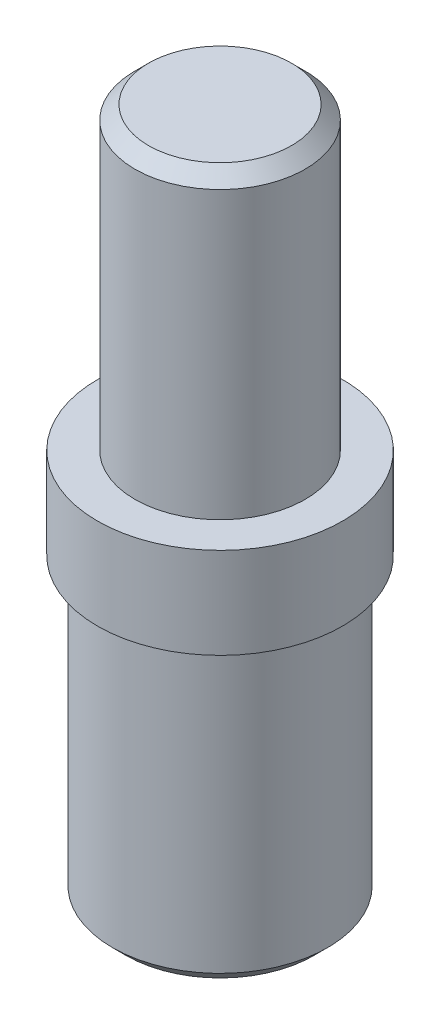
ISO-10303-21;
HEADER;
FILE_DESCRIPTION(('STEP AP214'),'2;1');
FILE_NAME('part.step','',(''),(''),'','','');
FILE_SCHEMA(('AUTOMOTIVE_DESIGN { 1 0 10303 214 1 1 1 1 }'));
ENDSEC;
DATA;
#1=APPLICATION_CONTEXT('core data for automotive mechanical design processes');
#2=APPLICATION_PROTOCOL_DEFINITION('international standard','automotive_design',2000,#1);
#3=PRODUCT_CONTEXT('',#1,'mechanical');
#4=PRODUCT('Part','Part','',(#3));
#5=PRODUCT_RELATED_PRODUCT_CATEGORY('part','',(#4));
#6=PRODUCT_DEFINITION_FORMATION('','',#4);
#7=PRODUCT_DEFINITION_CONTEXT('part definition',#1,'design');
#8=PRODUCT_DEFINITION('design','',#6,#7);
#9=PRODUCT_DEFINITION_SHAPE('','',#8);
#10=(LENGTH_UNIT() NAMED_UNIT(*) SI_UNIT(.MILLI.,.METRE.));
#11=(NAMED_UNIT(*) PLANE_ANGLE_UNIT() SI_UNIT($,.RADIAN.));
#12=(NAMED_UNIT(*) SI_UNIT($,.STERADIAN.) SOLID_ANGLE_UNIT());
#13=UNCERTAINTY_MEASURE_WITH_UNIT(LENGTH_MEASURE(1.E-05),#10,'distance_accuracy_value','');
#14=(GEOMETRIC_REPRESENTATION_CONTEXT(3) GLOBAL_UNCERTAINTY_ASSIGNED_CONTEXT((#13)) GLOBAL_UNIT_ASSIGNED_CONTEXT((#10,
#11,#12)) REPRESENTATION_CONTEXT('',''));
#15=CARTESIAN_POINT('',(0.,0.,0.));
#16=DIRECTION('',(0.,0.,1.));
#17=DIRECTION('',(1.,0.,0.));
#18=AXIS2_PLACEMENT_3D('',#15,#16,#17);
#19=CARTESIAN_POINT('',(0.,11.,0.));
#20=DIRECTION('',(0.,-1.,0.));
#21=DIRECTION('',(0.,0.,-1.));
#22=AXIS2_PLACEMENT_3D('',#19,#20,#21);
#23=CYLINDRICAL_SURFACE('',#22,3.95);
#24=CARTESIAN_POINT('',(0.,0.500000000000002,0.));
#25=DIRECTION('',(0.,1.,0.));
#26=DIRECTION('',(0.,0.,1.));
#27=AXIS2_PLACEMENT_3D('',#24,#25,#26);
#28=CIRCLE('',#27,3.95);
#29=CARTESIAN_POINT('',(0.,0.500000000000002,3.95));
#30=VERTEX_POINT('',#29);
#31=EDGE_CURVE('E47',#30,#30,#28,.T.);
#32=ORIENTED_EDGE('',*,*,#31,.T.);
#33=EDGE_LOOP('',(#32));
#34=FACE_BOUND('',#33,.T.);
#35=CARTESIAN_POINT('',(0.,11.,0.));
#36=DIRECTION('',(0.,1.,0.));
#37=DIRECTION('',(0.,0.,1.));
#38=AXIS2_PLACEMENT_3D('',#35,#36,#37);
#39=CIRCLE('',#38,3.95);
#40=CARTESIAN_POINT('',(0.,11.,3.95));
#41=VERTEX_POINT('',#40);
#42=EDGE_CURVE('E53',#41,#41,#39,.T.);
#43=ORIENTED_EDGE('',*,*,#42,.F.);
#44=EDGE_LOOP('',(#43));
#45=FACE_BOUND('',#44,.T.);
#46=ADVANCED_FACE('F32',(#34,#45),#23,.T.);
#47=CARTESIAN_POINT('',(0.,0.,0.));
#48=DIRECTION('',(0.,1.,0.));
#49=DIRECTION('',(0.,0.,1.));
#50=AXIS2_PLACEMENT_3D('',#47,#48,#49);
#51=PLANE('',#50);
#52=CARTESIAN_POINT('',(0.,0.,0.));
#53=DIRECTION('',(0.,1.,0.));
#54=DIRECTION('',(0.,0.,1.));
#55=AXIS2_PLACEMENT_3D('',#52,#53,#54);
#56=CIRCLE('',#55,3.45);
#57=CARTESIAN_POINT('',(0.,0.,3.45));
#58=VERTEX_POINT('',#57);
#59=EDGE_CURVE('E43',#58,#58,#56,.F.);
#60=ORIENTED_EDGE('',*,*,#59,.T.);
#61=EDGE_LOOP('',(#60));
#62=FACE_BOUND('',#61,.T.);
#63=ADVANCED_FACE('F77',(#62),#51,.F.);
#64=CARTESIAN_POINT('',(0.,14.34,0.));
#65=DIRECTION('',(0.,-1.,0.));
#66=DIRECTION('',(0.,0.,-1.));
#67=AXIS2_PLACEMENT_3D('',#64,#65,#66);
#68=CYLINDRICAL_SURFACE('',#67,4.5);
#69=CARTESIAN_POINT('',(0.,14.34,0.));
#70=DIRECTION('',(0.,1.,0.));
#71=DIRECTION('',(0.,0.,1.));
#72=AXIS2_PLACEMENT_3D('',#69,#70,#71);
#73=CIRCLE('',#72,4.5);
#74=CARTESIAN_POINT('',(0.,14.34,4.5));
#75=VERTEX_POINT('',#74);
#76=EDGE_CURVE('E56',#75,#75,#73,.T.);
#77=ORIENTED_EDGE('',*,*,#76,.F.);
#78=EDGE_LOOP('',(#77));
#79=FACE_BOUND('',#78,.T.);
#80=CARTESIAN_POINT('',(0.,11.,0.));
#81=DIRECTION('',(0.,1.,0.));
#82=DIRECTION('',(0.,0.,1.));
#83=AXIS2_PLACEMENT_3D('',#80,#81,#82);
#84=CIRCLE('',#83,4.5);
#85=CARTESIAN_POINT('',(0.,11.,4.5));
#86=VERTEX_POINT('',#85);
#87=EDGE_CURVE('E57',#86,#86,#84,.T.);
#88=ORIENTED_EDGE('',*,*,#87,.T.);
#89=EDGE_LOOP('',(#88));
#90=FACE_BOUND('',#89,.T.);
#91=ADVANCED_FACE('F71',(#79,#90),#68,.T.);
#92=CARTESIAN_POINT('',(0.,14.34,0.));
#93=DIRECTION('',(0.,1.,0.));
#94=DIRECTION('',(0.,0.,1.));
#95=AXIS2_PLACEMENT_3D('',#92,#93,#94);
#96=PLANE('',#95);
#97=CARTESIAN_POINT('',(0.,14.34,0.));
#98=DIRECTION('',(0.,1.,0.));
#99=DIRECTION('',(0.,0.,1.));
#100=AXIS2_PLACEMENT_3D('',#97,#98,#99);
#101=CIRCLE('',#100,3.125);
#102=CARTESIAN_POINT('',(0.,14.34,3.125));
#103=VERTEX_POINT('',#102);
#104=EDGE_CURVE('E52',#103,#103,#101,.T.);
#105=ORIENTED_EDGE('',*,*,#104,.F.);
#106=EDGE_LOOP('',(#105));
#107=FACE_BOUND('',#106,.T.);
#108=ORIENTED_EDGE('',*,*,#76,.T.);
#109=EDGE_LOOP('',(#108));
#110=FACE_BOUND('',#109,.T.);
#111=ADVANCED_FACE('F67',(#107,#110),#96,.T.);
#112=CARTESIAN_POINT('',(0.,11.,0.));
#113=DIRECTION('',(0.,1.,0.));
#114=DIRECTION('',(0.,0.,1.));
#115=AXIS2_PLACEMENT_3D('',#112,#113,#114);
#116=PLANE('',#115);
#117=ORIENTED_EDGE('',*,*,#42,.T.);
#118=EDGE_LOOP('',(#117));
#119=FACE_BOUND('',#118,.T.);
#120=ORIENTED_EDGE('',*,*,#87,.F.);
#121=EDGE_LOOP('',(#120));
#122=FACE_BOUND('',#121,.T.);
#123=ADVANCED_FACE('F70',(#119,#122),#116,.F.);
#124=CARTESIAN_POINT('',(0.,25.34,0.));
#125=DIRECTION('',(0.,-1.,0.));
#126=DIRECTION('',(0.,0.,-1.));
#127=AXIS2_PLACEMENT_3D('',#124,#125,#126);
#128=CYLINDRICAL_SURFACE('',#127,3.125);
#129=CARTESIAN_POINT('',(0.,24.84,0.));
#130=DIRECTION('',(0.,1.,0.));
#131=DIRECTION('',(0.,0.,1.));
#132=AXIS2_PLACEMENT_3D('',#129,#130,#131);
#133=CIRCLE('',#132,3.125);
#134=CARTESIAN_POINT('',(0.,24.84,3.125));
#135=VERTEX_POINT('',#134);
#136=EDGE_CURVE('E10',#135,#135,#133,.F.);
#137=ORIENTED_EDGE('',*,*,#136,.T.);
#138=EDGE_LOOP('',(#137));
#139=FACE_BOUND('',#138,.T.);
#140=ORIENTED_EDGE('',*,*,#104,.T.);
#141=EDGE_LOOP('',(#140));
#142=FACE_BOUND('',#141,.T.);
#143=ADVANCED_FACE('F65',(#139,#142),#128,.T.);
#144=CARTESIAN_POINT('',(0.,25.34,0.));
#145=DIRECTION('',(0.,1.,0.));
#146=DIRECTION('',(0.,0.,1.));
#147=AXIS2_PLACEMENT_3D('',#144,#145,#146);
#148=PLANE('',#147);
#149=CARTESIAN_POINT('',(0.,25.34,0.));
#150=DIRECTION('',(0.,1.,0.));
#151=DIRECTION('',(0.,0.,1.));
#152=AXIS2_PLACEMENT_3D('',#149,#150,#151);
#153=CIRCLE('',#152,2.625);
#154=CARTESIAN_POINT('',(0.,25.34,2.625));
#155=VERTEX_POINT('',#154);
#156=EDGE_CURVE('E39',#155,#155,#153,.T.);
#157=ORIENTED_EDGE('',*,*,#156,.T.);
#158=EDGE_LOOP('',(#157));
#159=FACE_BOUND('',#158,.T.);
#160=ADVANCED_FACE('F87',(#159),#148,.T.);
#161=CARTESIAN_POINT('',(0.,0.500000000000002,0.));
#162=DIRECTION('',(0.,1.,0.));
#163=DIRECTION('',(0.,0.,1.));
#164=AXIS2_PLACEMENT_3D('',#161,#162,#163);
#165=CONICAL_SURFACE('',#164,3.95,0.785398163397448);
#166=ORIENTED_EDGE('',*,*,#59,.F.);
#167=EDGE_LOOP('',(#166));
#168=FACE_BOUND('',#167,.T.);
#169=ORIENTED_EDGE('',*,*,#31,.F.);
#170=EDGE_LOOP('',(#169));
#171=FACE_BOUND('',#170,.T.);
#172=ADVANCED_FACE('F98',(#168,#171),#165,.T.);
#173=CARTESIAN_POINT('',(0.,25.34,0.));
#174=DIRECTION('',(0.,-1.,0.));
#175=DIRECTION('',(0.,0.,-1.));
#176=AXIS2_PLACEMENT_3D('',#173,#174,#175);
#177=CONICAL_SURFACE('',#176,2.625,0.785398163397453);
#178=ORIENTED_EDGE('',*,*,#136,.F.);
#179=EDGE_LOOP('',(#178));
#180=FACE_BOUND('',#179,.T.);
#181=ORIENTED_EDGE('',*,*,#156,.F.);
#182=EDGE_LOOP('',(#181));
#183=FACE_BOUND('',#182,.T.);
#184=ADVANCED_FACE('F34',(#180,#183),#177,.T.);
#185=CLOSED_SHELL('',(#46,#63,#91,#111,#123,#143,#160,#172,#184));
#186=MANIFOLD_SOLID_BREP('B2',#185);
#187=ADVANCED_BREP_SHAPE_REPRESENTATION('',(#18,#186),#14);
#188=SHAPE_DEFINITION_REPRESENTATION(#9,#187);
ENDSEC;
END-ISO-10303-21;
